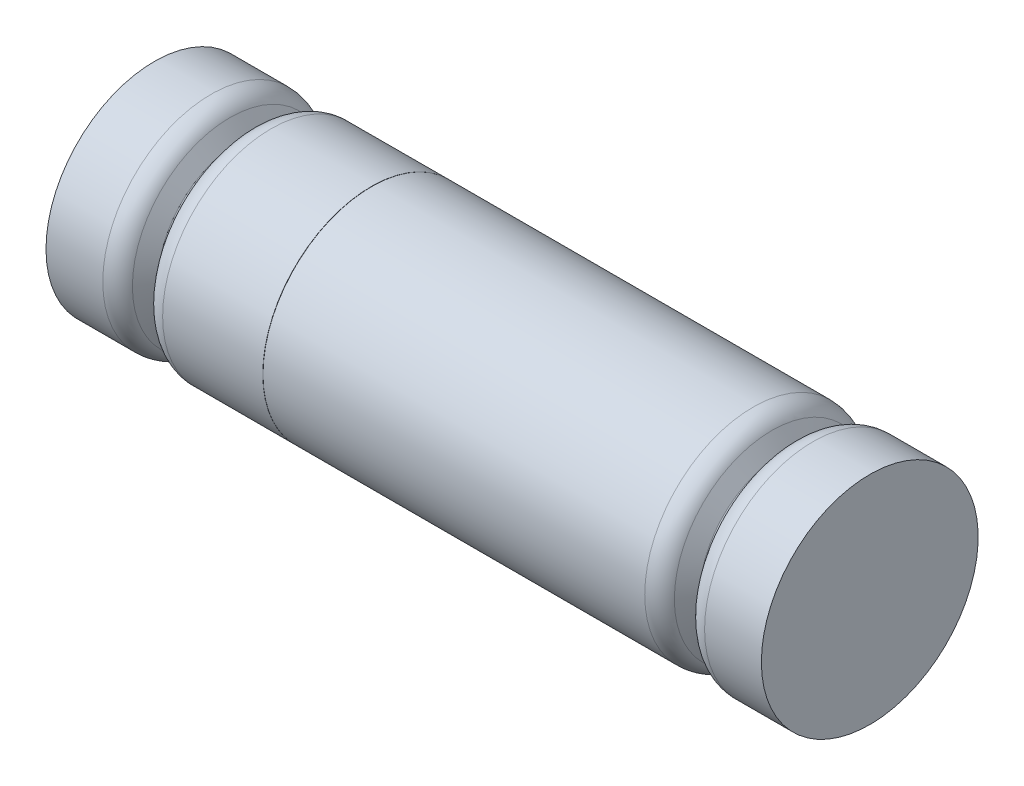
ISO-10303-21;
HEADER;
FILE_DESCRIPTION(('STEP AP214'),'2;1');
FILE_NAME('part.step','',(''),(''),'','','');
FILE_SCHEMA(('AUTOMOTIVE_DESIGN { 1 0 10303 214 1 1 1 1 }'));
ENDSEC;
DATA;
#1=APPLICATION_CONTEXT('core data for automotive mechanical design processes');
#2=APPLICATION_PROTOCOL_DEFINITION('international standard','automotive_design',2000,#1);
#3=PRODUCT_CONTEXT('',#1,'mechanical');
#4=PRODUCT('Part','Part','',(#3));
#5=PRODUCT_RELATED_PRODUCT_CATEGORY('part','',(#4));
#6=PRODUCT_DEFINITION_FORMATION('','',#4);
#7=PRODUCT_DEFINITION_CONTEXT('part definition',#1,'design');
#8=PRODUCT_DEFINITION('design','',#6,#7);
#9=PRODUCT_DEFINITION_SHAPE('','',#8);
#10=(LENGTH_UNIT() NAMED_UNIT(*) SI_UNIT(.MILLI.,.METRE.));
#11=(NAMED_UNIT(*) PLANE_ANGLE_UNIT() SI_UNIT($,.RADIAN.));
#12=(NAMED_UNIT(*) SI_UNIT($,.STERADIAN.) SOLID_ANGLE_UNIT());
#13=UNCERTAINTY_MEASURE_WITH_UNIT(LENGTH_MEASURE(1.E-05),#10,'distance_accuracy_value','');
#14=(GEOMETRIC_REPRESENTATION_CONTEXT(3) GLOBAL_UNCERTAINTY_ASSIGNED_CONTEXT((#13)) GLOBAL_UNIT_ASSIGNED_CONTEXT((#10,
#11,#12)) REPRESENTATION_CONTEXT('',''));
#15=CARTESIAN_POINT('',(0.,0.,0.));
#16=DIRECTION('',(0.,0.,1.));
#17=DIRECTION('',(1.,0.,0.));
#18=AXIS2_PLACEMENT_3D('',#15,#16,#17);
#19=CARTESIAN_POINT('',(0.,0.,0.));
#20=DIRECTION('',(1.,0.,0.));
#21=DIRECTION('',(0.,0.,-1.));
#22=AXIS2_PLACEMENT_3D('',#19,#20,#21);
#23=PLANE('',#22);
#24=CARTESIAN_POINT('',(0.,0.,0.));
#25=DIRECTION('',(-1.,0.,0.));
#26=DIRECTION('',(0.,0.,1.));
#27=AXIS2_PLACEMENT_3D('',#24,#25,#26);
#28=CIRCLE('',#27,0.5);
#29=CARTESIAN_POINT('',(0.,0.,0.5));
#30=VERTEX_POINT('',#29);
#31=EDGE_CURVE('E18',#30,#30,#28,.F.);
#32=ORIENTED_EDGE('',*,*,#31,.F.);
#33=EDGE_LOOP('',(#32));
#34=FACE_BOUND('',#33,.T.);
#35=ADVANCED_FACE('F15',(#34),#23,.F.);
#36=CARTESIAN_POINT('',(3.3,0.,0.));
#37=DIRECTION('',(-1.,0.,0.));
#38=DIRECTION('',(0.,0.,1.));
#39=AXIS2_PLACEMENT_3D('',#36,#37,#38);
#40=CYLINDRICAL_SURFACE('',#39,0.5);
#41=ORIENTED_EDGE('',*,*,#31,.T.);
#42=EDGE_LOOP('',(#41));
#43=FACE_BOUND('',#42,.T.);
#44=CARTESIAN_POINT('',(0.26196941827,0.,0.));
#45=DIRECTION('',(-1.,0.,0.));
#46=DIRECTION('',(0.,0.,1.));
#47=AXIS2_PLACEMENT_3D('',#44,#45,#46);
#48=CIRCLE('',#47,0.5);
#49=CARTESIAN_POINT('',(0.26196941827,0.,0.5));
#50=VERTEX_POINT('',#49);
#51=EDGE_CURVE('E31',#50,#50,#48,.F.);
#52=ORIENTED_EDGE('',*,*,#51,.F.);
#53=EDGE_LOOP('',(#52));
#54=FACE_BOUND('',#53,.T.);
#55=ADVANCED_FACE('F66',(#43,#54),#40,.T.);
#56=CARTESIAN_POINT('',(0.26196941827,0.,0.));
#57=DIRECTION('',(-1.,0.,0.));
#58=DIRECTION('',(0.,0.,1.));
#59=AXIS2_PLACEMENT_3D('',#56,#57,#58);
#60=TOROIDAL_SURFACE('',#59,0.4,0.1);
#61=ORIENTED_EDGE('',*,*,#51,.T.);
#62=EDGE_LOOP('',(#61));
#63=FACE_BOUND('',#62,.T.);
#64=CARTESIAN_POINT('',(0.348571958625143,0.,0.));
#65=DIRECTION('',(-1.,0.,0.));
#66=DIRECTION('',(0.,0.,1.));
#67=AXIS2_PLACEMENT_3D('',#64,#65,#66);
#68=CIRCLE('',#67,0.449999999943884);
#69=CARTESIAN_POINT('',(0.348571958625143,0.,0.449999999943884));
#70=VERTEX_POINT('',#69);
#71=EDGE_CURVE('E53',#70,#70,#68,.F.);
#72=ORIENTED_EDGE('',*,*,#71,.F.);
#73=EDGE_LOOP('',(#72));
#74=FACE_BOUND('',#73,.T.);
#75=ADVANCED_FACE('F62',(#63,#74),#60,.T.);
#76=CARTESIAN_POINT('',(0.34857195873883,0.,0.));
#77=DIRECTION('',(-1.,0.,0.));
#78=DIRECTION('',(0.,0.,1.));
#79=AXIS2_PLACEMENT_3D('',#76,#77,#78);
#80=CONICAL_SURFACE('',#79,0.449999999773354,1.04719755115895);
#81=ORIENTED_EDGE('',*,*,#71,.T.);
#82=EDGE_LOOP('',(#81));
#83=FACE_BOUND('',#82,.T.);
#84=CARTESIAN_POINT('',(0.391339745962117,0.,0.));
#85=DIRECTION('',(-1.,0.,0.));
#86=DIRECTION('',(0.,0.,1.));
#87=AXIS2_PLACEMENT_3D('',#84,#85,#86);
#88=CIRCLE('',#87,0.375924019445067);
#89=CARTESIAN_POINT('',(0.391339745962117,0.,0.375924019445067));
#90=VERTEX_POINT('',#89);
#91=EDGE_CURVE('E46',#90,#90,#88,.T.);
#92=ORIENTED_EDGE('',*,*,#91,.T.);
#93=EDGE_LOOP('',(#92));
#94=FACE_BOUND('',#93,.T.);
#95=ADVANCED_FACE('F65',(#83,#94),#80,.T.);
#96=CARTESIAN_POINT('',(3.3,0.,0.));
#97=DIRECTION('',(1.,0.,0.));
#98=DIRECTION('',(0.,0.,-1.));
#99=AXIS2_PLACEMENT_3D('',#96,#97,#98);
#100=PLANE('',#99);
#101=CARTESIAN_POINT('',(3.3,0.,0.));
#102=DIRECTION('',(-1.,0.,0.));
#103=DIRECTION('',(0.,0.,1.));
#104=AXIS2_PLACEMENT_3D('',#101,#102,#103);
#105=CIRCLE('',#104,0.5);
#106=CARTESIAN_POINT('',(3.3,0.,0.5));
#107=VERTEX_POINT('',#106);
#108=EDGE_CURVE('E43',#107,#107,#105,.T.);
#109=ORIENTED_EDGE('',*,*,#108,.F.);
#110=EDGE_LOOP('',(#109));
#111=FACE_BOUND('',#110,.T.);
#112=ADVANCED_FACE('F231',(#111),#100,.T.);
#113=CARTESIAN_POINT('',(3.3,0.,0.));
#114=DIRECTION('',(-1.,0.,0.));
#115=DIRECTION('',(0.,0.,1.));
#116=AXIS2_PLACEMENT_3D('',#113,#114,#115);
#117=CYLINDRICAL_SURFACE('',#116,0.5);
#118=ORIENTED_EDGE('',*,*,#108,.T.);
#119=EDGE_LOOP('',(#118));
#120=FACE_BOUND('',#119,.T.);
#121=CARTESIAN_POINT('',(3.03803058173,0.,0.));
#122=DIRECTION('',(-1.,0.,0.));
#123=DIRECTION('',(0.,0.,1.));
#124=AXIS2_PLACEMENT_3D('',#121,#122,#123);
#125=CIRCLE('',#124,0.5);
#126=CARTESIAN_POINT('',(3.03803058173,0.,0.5));
#127=VERTEX_POINT('',#126);
#128=EDGE_CURVE('E45',#127,#127,#125,.T.);
#129=ORIENTED_EDGE('',*,*,#128,.F.);
#130=EDGE_LOOP('',(#129));
#131=FACE_BOUND('',#130,.T.);
#132=ADVANCED_FACE('F143',(#120,#131),#117,.T.);
#133=CARTESIAN_POINT('',(0.4,0.,0.));
#134=DIRECTION('',(-1.,0.,0.));
#135=DIRECTION('',(0.,0.,1.));
#136=AXIS2_PLACEMENT_3D('',#133,#134,#135);
#137=TOROIDAL_SURFACE('',#136,0.380924019445,0.01);
#138=ORIENTED_EDGE('',*,*,#91,.F.);
#139=EDGE_LOOP('',(#138));
#140=FACE_BOUND('',#139,.T.);
#141=CARTESIAN_POINT('',(0.408660254038296,0.,0.));
#142=DIRECTION('',(1.,0.,0.));
#143=DIRECTION('',(0.,0.,-1.));
#144=AXIS2_PLACEMENT_3D('',#141,#142,#143);
#145=CIRCLE('',#144,0.375924019408558);
#146=CARTESIAN_POINT('',(0.408660254038296,0.,-0.375924019408558));
#147=VERTEX_POINT('',#146);
#148=EDGE_CURVE('E50',#147,#147,#145,.T.);
#149=ORIENTED_EDGE('',*,*,#148,.F.);
#150=EDGE_LOOP('',(#149));
#151=FACE_BOUND('',#150,.T.);
#152=ADVANCED_FACE('F139',(#140,#151),#137,.F.);
#153=CARTESIAN_POINT('',(3.03803058173,0.,0.));
#154=DIRECTION('',(-1.,0.,0.));
#155=DIRECTION('',(0.,0.,1.));
#156=AXIS2_PLACEMENT_3D('',#153,#154,#155);
#157=TOROIDAL_SURFACE('',#156,0.4,0.1);
#158=ORIENTED_EDGE('',*,*,#128,.T.);
#159=EDGE_LOOP('',(#158));
#160=FACE_BOUND('',#159,.T.);
#161=CARTESIAN_POINT('',(2.9514280413423,0.,0.));
#162=DIRECTION('',(1.,0.,0.));
#163=DIRECTION('',(0.,0.,-1.));
#164=AXIS2_PLACEMENT_3D('',#161,#162,#163);
#165=CIRCLE('',#164,0.449999999943884);
#166=CARTESIAN_POINT('',(2.9514280413423,0.,-0.449999999943884));
#167=VERTEX_POINT('',#166);
#168=EDGE_CURVE('E130',#167,#167,#165,.F.);
#169=ORIENTED_EDGE('',*,*,#168,.F.);
#170=EDGE_LOOP('',(#169));
#171=FACE_BOUND('',#170,.T.);
#172=ADVANCED_FACE('F135',(#160,#171),#157,.T.);
#173=CARTESIAN_POINT('',(0.451428041230884,0.,0.));
#174=DIRECTION('',(1.,0.,0.));
#175=DIRECTION('',(0.,0.,-1.));
#176=AXIS2_PLACEMENT_3D('',#173,#174,#175);
#177=CONICAL_SURFACE('',#176,0.449999999773354,1.04719755115895);
#178=CARTESIAN_POINT('',(0.451428041351667,0.,0.));
#179=DIRECTION('',(1.,0.,0.));
#180=DIRECTION('',(0.,0.,-1.));
#181=AXIS2_PLACEMENT_3D('',#178,#179,#180);
#182=CIRCLE('',#181,0.450000000000192);
#183=CARTESIAN_POINT('',(0.451428041351667,0.,-0.450000000000192));
#184=VERTEX_POINT('',#183);
#185=EDGE_CURVE('E127',#184,#184,#182,.T.);
#186=ORIENTED_EDGE('',*,*,#185,.F.);
#187=EDGE_LOOP('',(#186));
#188=FACE_BOUND('',#187,.T.);
#189=ORIENTED_EDGE('',*,*,#148,.T.);
#190=EDGE_LOOP('',(#189));
#191=FACE_BOUND('',#190,.T.);
#192=ADVANCED_FACE('F138',(#188,#191),#177,.T.);
#193=CARTESIAN_POINT('',(2.95142804128545,0.,0.));
#194=DIRECTION('',(1.,0.,0.));
#195=DIRECTION('',(0.,0.,-1.));
#196=AXIS2_PLACEMENT_3D('',#193,#194,#195);
#197=CONICAL_SURFACE('',#196,0.449999999887041,1.04719755115895);
#198=CARTESIAN_POINT('',(2.90866025403788,0.,0.));
#199=DIRECTION('',(-1.,0.,0.));
#200=DIRECTION('',(0.,0.,1.));
#201=AXIS2_PLACEMENT_3D('',#198,#199,#200);
#202=CIRCLE('',#201,0.375924019445068);
#203=CARTESIAN_POINT('',(2.90866025403788,0.,0.375924019445068));
#204=VERTEX_POINT('',#203);
#205=EDGE_CURVE('E124',#204,#204,#202,.F.);
#206=ORIENTED_EDGE('',*,*,#205,.T.);
#207=EDGE_LOOP('',(#206));
#208=FACE_BOUND('',#207,.T.);
#209=ORIENTED_EDGE('',*,*,#168,.T.);
#210=EDGE_LOOP('',(#209));
#211=FACE_BOUND('',#210,.T.);
#212=ADVANCED_FACE('F119',(#208,#211),#197,.T.);
#213=CARTESIAN_POINT('',(0.53803058173,0.,0.));
#214=DIRECTION('',(1.,0.,0.));
#215=DIRECTION('',(0.,0.,-1.));
#216=AXIS2_PLACEMENT_3D('',#213,#214,#215);
#217=TOROIDAL_SURFACE('',#216,0.4,0.1);
#218=CARTESIAN_POINT('',(0.53803058173,0.,0.));
#219=DIRECTION('',(-1.,0.,0.));
#220=DIRECTION('',(0.,0.,1.));
#221=AXIS2_PLACEMENT_3D('',#218,#219,#220);
#222=CIRCLE('',#221,0.5);
#223=CARTESIAN_POINT('',(0.53803058173,0.,0.5));
#224=VERTEX_POINT('',#223);
#225=EDGE_CURVE('E42',#224,#224,#222,.F.);
#226=ORIENTED_EDGE('',*,*,#225,.F.);
#227=EDGE_LOOP('',(#226));
#228=FACE_BOUND('',#227,.T.);
#229=ORIENTED_EDGE('',*,*,#185,.T.);
#230=EDGE_LOOP('',(#229));
#231=FACE_BOUND('',#230,.T.);
#232=ADVANCED_FACE('F115',(#228,#231),#217,.T.);
#233=CARTESIAN_POINT('',(3.3,0.,0.));
#234=DIRECTION('',(-1.,0.,0.));
#235=DIRECTION('',(0.,0.,1.));
#236=AXIS2_PLACEMENT_3D('',#233,#234,#235);
#237=CYLINDRICAL_SURFACE('',#236,0.5);
#238=ORIENTED_EDGE('',*,*,#225,.T.);
#239=EDGE_LOOP('',(#238));
#240=FACE_BOUND('',#239,.T.);
#241=CARTESIAN_POINT('',(1.,0.,0.));
#242=DIRECTION('',(-1.,0.,0.));
#243=DIRECTION('',(0.,0.,1.));
#244=AXIS2_PLACEMENT_3D('',#241,#242,#243);
#245=CIRCLE('',#244,0.5);
#246=CARTESIAN_POINT('',(1.,0.,0.5));
#247=VERTEX_POINT('',#246);
#248=EDGE_CURVE('E40',#247,#247,#245,.T.);
#249=ORIENTED_EDGE('',*,*,#248,.T.);
#250=EDGE_LOOP('',(#249));
#251=FACE_BOUND('',#250,.T.);
#252=ADVANCED_FACE('F111',(#240,#251),#237,.T.);
#253=CARTESIAN_POINT('',(2.9,0.,0.));
#254=DIRECTION('',(-1.,0.,0.));
#255=DIRECTION('',(0.,0.,1.));
#256=AXIS2_PLACEMENT_3D('',#253,#254,#255);
#257=TOROIDAL_SURFACE('',#256,0.380924019445,0.01);
#258=ORIENTED_EDGE('',*,*,#205,.F.);
#259=EDGE_LOOP('',(#258));
#260=FACE_BOUND('',#259,.T.);
#261=CARTESIAN_POINT('',(2.89133974592914,0.,0.));
#262=DIRECTION('',(-1.,0.,0.));
#263=DIRECTION('',(0.,0.,1.));
#264=AXIS2_PLACEMENT_3D('',#261,#262,#263);
#265=CIRCLE('',#264,0.375924019465401);
#266=CARTESIAN_POINT('',(2.89133974592914,0.,0.375924019465401));
#267=VERTEX_POINT('',#266);
#268=EDGE_CURVE('E39',#267,#267,#265,.T.);
#269=ORIENTED_EDGE('',*,*,#268,.F.);
#270=EDGE_LOOP('',(#269));
#271=FACE_BOUND('',#270,.T.);
#272=ADVANCED_FACE('F106',(#260,#271),#257,.F.);
#273=CARTESIAN_POINT('',(1.,0.,0.));
#274=DIRECTION('',(-1.,0.,0.));
#275=DIRECTION('',(0.,0.,1.));
#276=AXIS2_PLACEMENT_3D('',#273,#274,#275);
#277=PLANE('',#276);
#278=ORIENTED_EDGE('',*,*,#248,.F.);
#279=EDGE_LOOP('',(#278));
#280=FACE_BOUND('',#279,.T.);
#281=CARTESIAN_POINT('',(1.,0.,0.));
#282=DIRECTION('',(-1.,0.,0.));
#283=DIRECTION('',(0.,0.,1.));
#284=AXIS2_PLACEMENT_3D('',#281,#282,#283);
#285=CIRCLE('',#284,0.495);
#286=CARTESIAN_POINT('',(1.,0.,0.495));
#287=VERTEX_POINT('',#286);
#288=EDGE_CURVE('E36',#287,#287,#285,.F.);
#289=ORIENTED_EDGE('',*,*,#288,.F.);
#290=EDGE_LOOP('',(#289));
#291=FACE_BOUND('',#290,.T.);
#292=ADVANCED_FACE('F110',(#280,#291),#277,.F.);
#293=CARTESIAN_POINT('',(2.84857195873656,0.,0.));
#294=DIRECTION('',(-1.,0.,0.));
#295=DIRECTION('',(0.,0.,1.));
#296=AXIS2_PLACEMENT_3D('',#293,#294,#295);
#297=CONICAL_SURFACE('',#296,0.449999999773354,1.04719755115895);
#298=ORIENTED_EDGE('',*,*,#268,.T.);
#299=EDGE_LOOP('',(#298));
#300=FACE_BOUND('',#299,.T.);
#301=CARTESIAN_POINT('',(2.84857195864833,0.,0.));
#302=DIRECTION('',(1.,0.,0.));
#303=DIRECTION('',(0.,0.,-1.));
#304=AXIS2_PLACEMENT_3D('',#301,#302,#303);
#305=CIRCLE('',#304,0.450000000000192);
#306=CARTESIAN_POINT('',(2.84857195864833,0.,-0.450000000000192));
#307=VERTEX_POINT('',#306);
#308=EDGE_CURVE('E35',#307,#307,#305,.F.);
#309=ORIENTED_EDGE('',*,*,#308,.F.);
#310=EDGE_LOOP('',(#309));
#311=FACE_BOUND('',#310,.T.);
#312=ADVANCED_FACE('F163',(#300,#311),#297,.T.);
#313=CARTESIAN_POINT('',(1.001,0.,0.));
#314=DIRECTION('',(-1.,0.,0.));
#315=DIRECTION('',(0.,0.,1.));
#316=AXIS2_PLACEMENT_3D('',#313,#314,#315);
#317=CYLINDRICAL_SURFACE('',#316,0.495);
#318=CARTESIAN_POINT('',(1.001,0.,0.));
#319=DIRECTION('',(-1.,0.,0.));
#320=DIRECTION('',(0.,0.,1.));
#321=AXIS2_PLACEMENT_3D('',#318,#319,#320);
#322=CIRCLE('',#321,0.495);
#323=CARTESIAN_POINT('',(1.001,0.,0.495));
#324=VERTEX_POINT('',#323);
#325=EDGE_CURVE('E27',#324,#324,#322,.F.);
#326=ORIENTED_EDGE('',*,*,#325,.F.);
#327=EDGE_LOOP('',(#326));
#328=FACE_BOUND('',#327,.T.);
#329=ORIENTED_EDGE('',*,*,#288,.T.);
#330=EDGE_LOOP('',(#329));
#331=FACE_BOUND('',#330,.T.);
#332=ADVANCED_FACE('F93',(#328,#331),#317,.T.);
#333=CARTESIAN_POINT('',(2.76196941827,0.,0.));
#334=DIRECTION('',(1.,0.,0.));
#335=DIRECTION('',(0.,0.,-1.));
#336=AXIS2_PLACEMENT_3D('',#333,#334,#335);
#337=TOROIDAL_SURFACE('',#336,0.4,0.1);
#338=CARTESIAN_POINT('',(2.76196941827,0.,0.));
#339=DIRECTION('',(-1.,0.,0.));
#340=DIRECTION('',(0.,0.,1.));
#341=AXIS2_PLACEMENT_3D('',#338,#339,#340);
#342=CIRCLE('',#341,0.5);
#343=CARTESIAN_POINT('',(2.76196941827,0.,0.5));
#344=VERTEX_POINT('',#343);
#345=EDGE_CURVE('E22',#344,#344,#342,.T.);
#346=ORIENTED_EDGE('',*,*,#345,.F.);
#347=EDGE_LOOP('',(#346));
#348=FACE_BOUND('',#347,.T.);
#349=ORIENTED_EDGE('',*,*,#308,.T.);
#350=EDGE_LOOP('',(#349));
#351=FACE_BOUND('',#350,.T.);
#352=ADVANCED_FACE('F86',(#348,#351),#337,.T.);
#353=CARTESIAN_POINT('',(1.001,0.,0.));
#354=DIRECTION('',(-1.,0.,0.));
#355=DIRECTION('',(0.,0.,1.));
#356=AXIS2_PLACEMENT_3D('',#353,#354,#355);
#357=PLANE('',#356);
#358=CARTESIAN_POINT('',(1.001,0.,0.));
#359=DIRECTION('',(-1.,0.,0.));
#360=DIRECTION('',(0.,0.,1.));
#361=AXIS2_PLACEMENT_3D('',#358,#359,#360);
#362=CIRCLE('',#361,0.5);
#363=CARTESIAN_POINT('',(1.001,0.,0.5));
#364=VERTEX_POINT('',#363);
#365=EDGE_CURVE('E10',#364,#364,#362,.F.);
#366=ORIENTED_EDGE('',*,*,#365,.F.);
#367=EDGE_LOOP('',(#366));
#368=FACE_BOUND('',#367,.T.);
#369=ORIENTED_EDGE('',*,*,#325,.T.);
#370=EDGE_LOOP('',(#369));
#371=FACE_BOUND('',#370,.T.);
#372=ADVANCED_FACE('F80',(#368,#371),#357,.T.);
#373=CARTESIAN_POINT('',(3.3,0.,0.));
#374=DIRECTION('',(-1.,0.,0.));
#375=DIRECTION('',(0.,0.,1.));
#376=AXIS2_PLACEMENT_3D('',#373,#374,#375);
#377=CYLINDRICAL_SURFACE('',#376,0.5);
#378=ORIENTED_EDGE('',*,*,#345,.T.);
#379=EDGE_LOOP('',(#378));
#380=FACE_BOUND('',#379,.T.);
#381=ORIENTED_EDGE('',*,*,#365,.T.);
#382=EDGE_LOOP('',(#381));
#383=FACE_BOUND('',#382,.T.);
#384=ADVANCED_FACE('F78',(#380,#383),#377,.T.);
#385=CLOSED_SHELL('',(#35,#55,#75,#95,#112,#132,#152,#172,#192,#212,#232,#252,#272,#292,#312,
#332,#352,#372,#384));
#386=MANIFOLD_SOLID_BREP('B1',#385);
#387=ADVANCED_BREP_SHAPE_REPRESENTATION('',(#18,#386),#14);
#388=SHAPE_DEFINITION_REPRESENTATION(#9,#387);
ENDSEC;
END-ISO-10303-21;
